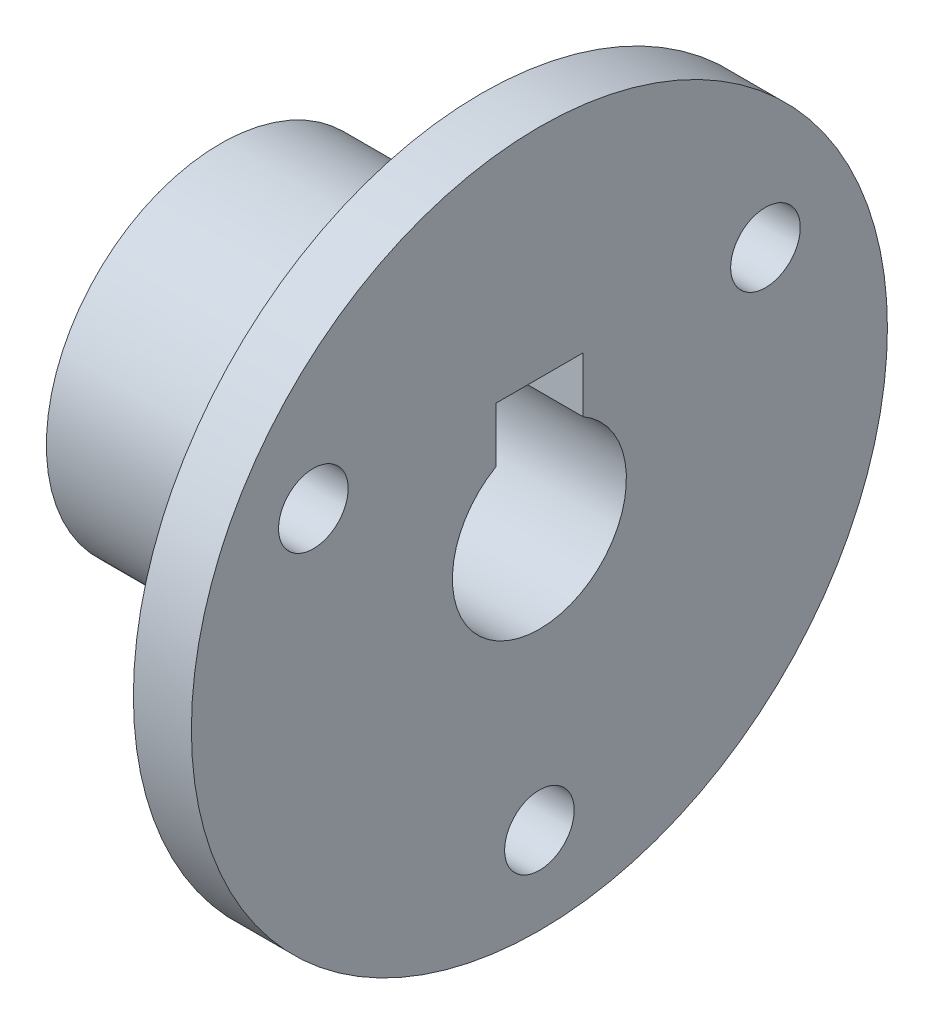
ISO-10303-21;
HEADER;
FILE_DESCRIPTION(('STEP AP214'),'2;1');
FILE_NAME('part.step','',(''),(''),'','','');
FILE_SCHEMA(('AUTOMOTIVE_DESIGN { 1 0 10303 214 1 1 1 1 }'));
ENDSEC;
DATA;
#1=APPLICATION_CONTEXT('core data for automotive mechanical design processes');
#2=APPLICATION_PROTOCOL_DEFINITION('international standard','automotive_design',2000,#1);
#3=PRODUCT_CONTEXT('',#1,'mechanical');
#4=PRODUCT('Part','Part','',(#3));
#5=PRODUCT_RELATED_PRODUCT_CATEGORY('part','',(#4));
#6=PRODUCT_DEFINITION_FORMATION('','',#4);
#7=PRODUCT_DEFINITION_CONTEXT('part definition',#1,'design');
#8=PRODUCT_DEFINITION('design','',#6,#7);
#9=PRODUCT_DEFINITION_SHAPE('','',#8);
#10=(LENGTH_UNIT() NAMED_UNIT(*) SI_UNIT(.MILLI.,.METRE.));
#11=(NAMED_UNIT(*) PLANE_ANGLE_UNIT() SI_UNIT($,.RADIAN.));
#12=(NAMED_UNIT(*) SI_UNIT($,.STERADIAN.) SOLID_ANGLE_UNIT());
#13=UNCERTAINTY_MEASURE_WITH_UNIT(LENGTH_MEASURE(1.E-05),#10,'distance_accuracy_value','');
#14=(GEOMETRIC_REPRESENTATION_CONTEXT(3) GLOBAL_UNCERTAINTY_ASSIGNED_CONTEXT((#13)) GLOBAL_UNIT_ASSIGNED_CONTEXT((#10,
#11,#12)) REPRESENTATION_CONTEXT('',''));
#15=CARTESIAN_POINT('',(0.,0.,0.));
#16=DIRECTION('',(0.,0.,1.));
#17=DIRECTION('',(1.,0.,0.));
#18=AXIS2_PLACEMENT_3D('',#15,#16,#17);
#19=CARTESIAN_POINT('',(10.,0.,0.));
#20=DIRECTION('',(-1.,0.,0.));
#21=DIRECTION('',(0.,0.,1.));
#22=AXIS2_PLACEMENT_3D('',#19,#20,#21);
#23=CYLINDRICAL_SURFACE('',#22,60.);
#24=CARTESIAN_POINT('',(10.,0.,0.));
#25=DIRECTION('',(-1.,0.,0.));
#26=DIRECTION('',(0.,0.,1.));
#27=AXIS2_PLACEMENT_3D('',#24,#25,#26);
#28=CIRCLE('',#27,60.);
#29=CARTESIAN_POINT('',(10.,0.,60.));
#30=VERTEX_POINT('',#29);
#31=EDGE_CURVE('E43',#30,#30,#28,.T.);
#32=ORIENTED_EDGE('',*,*,#31,.T.);
#33=EDGE_LOOP('',(#32));
#34=FACE_BOUND('',#33,.T.);
#35=CARTESIAN_POINT('',(0.,0.,0.));
#36=DIRECTION('',(-1.,0.,0.));
#37=DIRECTION('',(0.,0.,1.));
#38=AXIS2_PLACEMENT_3D('',#35,#36,#37);
#39=CIRCLE('',#38,60.);
#40=CARTESIAN_POINT('',(0.,0.,60.));
#41=VERTEX_POINT('',#40);
#42=EDGE_CURVE('E116',#41,#41,#39,.T.);
#43=ORIENTED_EDGE('',*,*,#42,.F.);
#44=EDGE_LOOP('',(#43));
#45=FACE_BOUND('',#44,.T.);
#46=ADVANCED_FACE('F40',(#34,#45),#23,.T.);
#47=CARTESIAN_POINT('',(10.,60.,0.));
#48=DIRECTION('',(1.,0.,0.));
#49=DIRECTION('',(0.,0.,-1.));
#50=AXIS2_PLACEMENT_3D('',#47,#48,#49);
#51=PLANE('',#50);
#52=CARTESIAN_POINT('',(10.,22.4999999999996,-38.9711431702999));
#53=DIRECTION('',(-1.,0.,0.));
#54=DIRECTION('',(0.,0.,1.));
#55=AXIS2_PLACEMENT_3D('',#52,#53,#54);
#56=CIRCLE('',#55,6.);
#57=CARTESIAN_POINT('',(10.,22.4999999999996,-32.9711431702999));
#58=VERTEX_POINT('',#57);
#59=EDGE_CURVE('E170',#58,#58,#56,.T.);
#60=ORIENTED_EDGE('',*,*,#59,.T.);
#61=EDGE_LOOP('',(#60));
#62=FACE_BOUND('',#61,.T.);
#63=CARTESIAN_POINT('',(10.,22.5000000000002,38.9711431702996));
#64=DIRECTION('',(-1.,0.,0.));
#65=DIRECTION('',(0.,0.,1.));
#66=AXIS2_PLACEMENT_3D('',#63,#64,#65);
#67=CIRCLE('',#66,6.);
#68=CARTESIAN_POINT('',(10.,22.5000000000002,44.9711431702996));
#69=VERTEX_POINT('',#68);
#70=EDGE_CURVE('E180',#69,#69,#67,.T.);
#71=ORIENTED_EDGE('',*,*,#70,.T.);
#72=EDGE_LOOP('',(#71));
#73=FACE_BOUND('',#72,.T.);
#74=CARTESIAN_POINT('',(10.,-45.,0.));
#75=DIRECTION('',(-1.,0.,0.));
#76=DIRECTION('',(0.,0.,1.));
#77=AXIS2_PLACEMENT_3D('',#74,#75,#76);
#78=CIRCLE('',#77,6.);
#79=CARTESIAN_POINT('',(10.,-45.,5.99999999999999));
#80=VERTEX_POINT('',#79);
#81=EDGE_CURVE('E88',#80,#80,#78,.T.);
#82=ORIENTED_EDGE('',*,*,#81,.T.);
#83=EDGE_LOOP('',(#82));
#84=FACE_BOUND('',#83,.T.);
#85=CARTESIAN_POINT('',(10.,0.,0.));
#86=DIRECTION('',(-1.,0.,0.));
#87=DIRECTION('',(0.,0.,1.));
#88=AXIS2_PLACEMENT_3D('',#85,#86,#87);
#89=CIRCLE('',#88,15.);
#90=CARTESIAN_POINT('',(10.,12.9903810567666,-7.5));
#91=VERTEX_POINT('',#90);
#92=CARTESIAN_POINT('',(10.,12.9903810567666,7.5));
#93=VERTEX_POINT('',#92);
#94=EDGE_CURVE('E55',#91,#93,#89,.T.);
#95=ORIENTED_EDGE('',*,*,#94,.T.);
#96=DIRECTION('',(0.,1.,0.));
#97=VECTOR('',#96,1.);
#98=CARTESIAN_POINT('',(10.,12.9903810567666,7.5));
#99=LINE('',#98,#97);
#100=CARTESIAN_POINT('',(10.,22.4956476755138,7.5));
#101=VERTEX_POINT('',#100);
#102=EDGE_CURVE('E96',#93,#101,#99,.T.);
#103=ORIENTED_EDGE('',*,*,#102,.T.);
#104=DIRECTION('',(0.,0.,-1.));
#105=VECTOR('',#104,1.);
#106=CARTESIAN_POINT('',(10.,22.4956476755138,7.5));
#107=LINE('',#106,#105);
#108=CARTESIAN_POINT('',(10.,22.4956476755138,-7.5));
#109=VERTEX_POINT('',#108);
#110=EDGE_CURVE('E101',#101,#109,#107,.T.);
#111=ORIENTED_EDGE('',*,*,#110,.T.);
#112=DIRECTION('',(0.,-1.,0.));
#113=VECTOR('',#112,1.);
#114=CARTESIAN_POINT('',(10.,22.4956476755138,-7.5));
#115=LINE('',#114,#113);
#116=EDGE_CURVE('E105',#109,#91,#115,.T.);
#117=ORIENTED_EDGE('',*,*,#116,.T.);
#118=EDGE_LOOP('',(#95,#103,#111,#117));
#119=FACE_BOUND('',#118,.T.);
#120=ORIENTED_EDGE('',*,*,#31,.F.);
#121=EDGE_LOOP('',(#120));
#122=FACE_BOUND('',#121,.T.);
#123=ADVANCED_FACE('F125',(#62,#73,#84,#119,#122),#51,.T.);
#124=CARTESIAN_POINT('',(0.,0.,0.));
#125=DIRECTION('',(-1.,0.,0.));
#126=DIRECTION('',(0.,0.,1.));
#127=AXIS2_PLACEMENT_3D('',#124,#125,#126);
#128=PLANE('',#127);
#129=CARTESIAN_POINT('',(0.,22.4999999999996,-38.9711431702999));
#130=DIRECTION('',(-1.,0.,0.));
#131=DIRECTION('',(0.,0.,1.));
#132=AXIS2_PLACEMENT_3D('',#129,#130,#131);
#133=CIRCLE('',#132,6.);
#134=CARTESIAN_POINT('',(0.,22.4999999999996,-32.9711431702999));
#135=VERTEX_POINT('',#134);
#136=EDGE_CURVE('E173',#135,#135,#133,.T.);
#137=ORIENTED_EDGE('',*,*,#136,.F.);
#138=EDGE_LOOP('',(#137));
#139=FACE_BOUND('',#138,.T.);
#140=CARTESIAN_POINT('',(0.,22.5000000000002,38.9711431702996));
#141=DIRECTION('',(-1.,0.,0.));
#142=DIRECTION('',(0.,0.,1.));
#143=AXIS2_PLACEMENT_3D('',#140,#141,#142);
#144=CIRCLE('',#143,6.);
#145=CARTESIAN_POINT('',(0.,22.5000000000002,44.9711431702996));
#146=VERTEX_POINT('',#145);
#147=EDGE_CURVE('E175',#146,#146,#144,.T.);
#148=ORIENTED_EDGE('',*,*,#147,.F.);
#149=EDGE_LOOP('',(#148));
#150=FACE_BOUND('',#149,.T.);
#151=CARTESIAN_POINT('',(0.,-45.,0.));
#152=DIRECTION('',(-1.,0.,0.));
#153=DIRECTION('',(0.,0.,1.));
#154=AXIS2_PLACEMENT_3D('',#151,#152,#153);
#155=CIRCLE('',#154,6.);
#156=CARTESIAN_POINT('',(0.,-45.,5.99999999999999));
#157=VERTEX_POINT('',#156);
#158=EDGE_CURVE('E183',#157,#157,#155,.T.);
#159=ORIENTED_EDGE('',*,*,#158,.F.);
#160=EDGE_LOOP('',(#159));
#161=FACE_BOUND('',#160,.T.);
#162=CARTESIAN_POINT('',(0.,0.,0.));
#163=DIRECTION('',(-1.,0.,0.));
#164=DIRECTION('',(0.,0.,1.));
#165=AXIS2_PLACEMENT_3D('',#162,#163,#164);
#166=CIRCLE('',#165,30.);
#167=CARTESIAN_POINT('',(0.,0.,-30.));
#168=VERTEX_POINT('',#167);
#169=EDGE_CURVE('E11',#168,#168,#166,.T.);
#170=ORIENTED_EDGE('',*,*,#169,.F.);
#171=EDGE_LOOP('',(#170));
#172=FACE_BOUND('',#171,.T.);
#173=ORIENTED_EDGE('',*,*,#42,.T.);
#174=EDGE_LOOP('',(#173));
#175=FACE_BOUND('',#174,.T.);
#176=ADVANCED_FACE('F127',(#139,#150,#161,#172,#175),#128,.T.);
#177=CARTESIAN_POINT('',(-45.,0.,0.));
#178=DIRECTION('',(1.,0.,0.));
#179=DIRECTION('',(0.,0.,-1.));
#180=AXIS2_PLACEMENT_3D('',#177,#178,#179);
#181=CYLINDRICAL_SURFACE('',#180,30.);
#182=CARTESIAN_POINT('',(-45.,0.,0.));
#183=DIRECTION('',(-1.,0.,0.));
#184=DIRECTION('',(0.,0.,1.));
#185=AXIS2_PLACEMENT_3D('',#182,#183,#184);
#186=CIRCLE('',#185,30.);
#187=CARTESIAN_POINT('',(-45.,0.,-30.));
#188=VERTEX_POINT('',#187);
#189=EDGE_CURVE('E110',#188,#188,#186,.T.);
#190=CARTESIAN_POINT('',(-45.,0.,-30.));
#191=CARTESIAN_POINT('',(-44.53125,0.,-30.));
#192=CARTESIAN_POINT('',(-44.0625,0.,-30.));
#193=CARTESIAN_POINT('',(-43.125,0.,-30.));
#194=CARTESIAN_POINT('',(-42.65625,0.,-30.));
#195=CARTESIAN_POINT('',(-41.71875,0.,-30.));
#196=CARTESIAN_POINT('',(-41.25,0.,-30.));
#197=CARTESIAN_POINT('',(-40.3125,0.,-30.));
#198=CARTESIAN_POINT('',(-39.84375,0.,-30.));
#199=CARTESIAN_POINT('',(-38.90625,0.,-30.));
#200=CARTESIAN_POINT('',(-38.4375,0.,-30.));
#201=CARTESIAN_POINT('',(-37.5,0.,-30.));
#202=CARTESIAN_POINT('',(-37.03125,0.,-30.));
#203=CARTESIAN_POINT('',(-36.09375,0.,-30.));
#204=CARTESIAN_POINT('',(-35.625,0.,-30.));
#205=CARTESIAN_POINT('',(-34.6875,0.,-30.));
#206=CARTESIAN_POINT('',(-34.21875,0.,-30.));
#207=CARTESIAN_POINT('',(-33.28125,0.,-30.));
#208=CARTESIAN_POINT('',(-32.8125,0.,-30.));
#209=CARTESIAN_POINT('',(-31.875,0.,-30.));
#210=CARTESIAN_POINT('',(-31.40625,0.,-30.));
#211=CARTESIAN_POINT('',(-30.46875,0.,-30.));
#212=CARTESIAN_POINT('',(-30.,0.,-30.));
#213=CARTESIAN_POINT('',(-29.0625,0.,-30.));
#214=CARTESIAN_POINT('',(-28.59375,0.,-30.));
#215=CARTESIAN_POINT('',(-27.65625,0.,-30.));
#216=CARTESIAN_POINT('',(-27.1875,0.,-30.));
#217=CARTESIAN_POINT('',(-26.25,0.,-30.));
#218=CARTESIAN_POINT('',(-25.78125,0.,-30.));
#219=CARTESIAN_POINT('',(-24.84375,0.,-30.));
#220=CARTESIAN_POINT('',(-24.375,0.,-30.));
#221=CARTESIAN_POINT('',(-23.4375,0.,-30.));
#222=CARTESIAN_POINT('',(-22.96875,0.,-30.));
#223=CARTESIAN_POINT('',(-22.03125,0.,-30.));
#224=CARTESIAN_POINT('',(-21.5625,0.,-30.));
#225=CARTESIAN_POINT('',(-20.625,0.,-30.));
#226=CARTESIAN_POINT('',(-20.15625,0.,-30.));
#227=CARTESIAN_POINT('',(-19.21875,0.,-30.));
#228=CARTESIAN_POINT('',(-18.75,0.,-30.));
#229=CARTESIAN_POINT('',(-17.8125,0.,-30.));
#230=CARTESIAN_POINT('',(-17.34375,0.,-30.));
#231=CARTESIAN_POINT('',(-16.40625,0.,-30.));
#232=CARTESIAN_POINT('',(-15.9375,0.,-30.));
#233=CARTESIAN_POINT('',(-15.,0.,-30.));
#234=CARTESIAN_POINT('',(-14.53125,0.,-30.));
#235=CARTESIAN_POINT('',(-13.59375,0.,-30.));
#236=CARTESIAN_POINT('',(-13.125,0.,-30.));
#237=CARTESIAN_POINT('',(-12.1875,0.,-30.));
#238=CARTESIAN_POINT('',(-11.71875,0.,-30.));
#239=CARTESIAN_POINT('',(-10.78125,0.,-30.));
#240=CARTESIAN_POINT('',(-10.3125,0.,-30.));
#241=CARTESIAN_POINT('',(-9.375,0.,-30.));
#242=CARTESIAN_POINT('',(-8.90625,0.,-30.));
#243=CARTESIAN_POINT('',(-7.96874999999999,0.,-30.));
#244=CARTESIAN_POINT('',(-7.5,0.,-30.));
#245=CARTESIAN_POINT('',(-6.5625,0.,-30.));
#246=CARTESIAN_POINT('',(-6.09375,0.,-30.));
#247=CARTESIAN_POINT('',(-5.15625,0.,-30.));
#248=CARTESIAN_POINT('',(-4.68749999999999,0.,-30.));
#249=CARTESIAN_POINT('',(-3.74999999999999,0.,-30.));
#250=CARTESIAN_POINT('',(-3.28124999999999,0.,-30.));
#251=CARTESIAN_POINT('',(-2.34374999999999,0.,-30.));
#252=CARTESIAN_POINT('',(-1.87499999999999,0.,-30.));
#253=CARTESIAN_POINT('',(-0.937499999999992,0.,-30.));
#254=CARTESIAN_POINT('',(-0.468749999999993,0.,-30.));
#255=CARTESIAN_POINT('',(0.,0.,-30.));
#256=B_SPLINE_CURVE_WITH_KNOTS('',3,(#190,#191,#192,#193,#194,#195,#196,#197,#198,#199,#200,
#201,#202,#203,#204,#205,#206,#207,#208,#209,#210,#211,#212,#213,#214,#215,#216,#217,#218,#219,
#220,#221,#222,#223,#224,#225,#226,#227,#228,#229,#230,#231,#232,#233,#234,#235,#236,#237,#238,
#239,#240,#241,#242,#243,#244,#245,#246,#247,#248,#249,#250,#251,#252,#253,#254,#255),
.UNSPECIFIED.,.F.,.F.,(4,2,2,2,2,2,2,2,2,2,2,2,2,2,2,2,2,2,2,2,2,2,2,2,2,2,2,2,2,2,2,2,4),(0.,
1.40625,2.8125,4.21875000000001,5.62500000000001,7.03125,8.4375,9.84375000000001,11.25,12.65625,
14.0625,15.46875,16.875,18.28125,19.6875,21.09375,22.5,23.90625,25.3125,26.71875,28.125,
29.53125,30.9375,32.34375,33.75,35.15625,36.5625,37.96875,39.375,40.78125,42.1875,43.59375,45.),.UNSPECIFIED.);
#257=EDGE_CURVE('BSEAM133',#188,#168,#256,.T.);
#258=ORIENTED_EDGE('',*,*,#189,.F.);
#259=ORIENTED_EDGE('',*,*,#169,.T.);
#260=ORIENTED_EDGE('',*,*,#257,.T.);
#261=ORIENTED_EDGE('',*,*,#257,.F.);
#262=EDGE_LOOP('',(#258,#260,#259,#261));
#263=FACE_BOUND('',#262,.T.);
#264=ADVANCED_FACE('F133',(#263),#181,.T.);
#265=CARTESIAN_POINT('',(-45.,0.,0.));
#266=DIRECTION('',(-1.,0.,0.));
#267=DIRECTION('',(0.,0.,1.));
#268=AXIS2_PLACEMENT_3D('',#265,#266,#267);
#269=PLANE('',#268);
#270=CARTESIAN_POINT('',(-45.,0.,0.));
#271=DIRECTION('',(-1.,0.,0.));
#272=DIRECTION('',(0.,0.,1.));
#273=AXIS2_PLACEMENT_3D('',#270,#271,#272);
#274=CIRCLE('',#273,15.);
#275=CARTESIAN_POINT('',(-45.,12.9903810567666,-7.5));
#276=VERTEX_POINT('',#275);
#277=CARTESIAN_POINT('',(-45.,12.9903810567666,7.5));
#278=VERTEX_POINT('',#277);
#279=EDGE_CURVE('E79',#276,#278,#274,.T.);
#280=ORIENTED_EDGE('',*,*,#279,.F.);
#281=DIRECTION('',(0.,-1.,0.));
#282=VECTOR('',#281,1.);
#283=CARTESIAN_POINT('',(-45.,22.4956476755138,-7.5));
#284=LINE('',#283,#282);
#285=CARTESIAN_POINT('',(-45.,22.4956476755138,-7.5));
#286=VERTEX_POINT('',#285);
#287=EDGE_CURVE('E102',#286,#276,#284,.T.);
#288=ORIENTED_EDGE('',*,*,#287,.F.);
#289=DIRECTION('',(0.,0.,-1.));
#290=VECTOR('',#289,1.);
#291=CARTESIAN_POINT('',(-45.,22.4956476755138,7.5));
#292=LINE('',#291,#290);
#293=CARTESIAN_POINT('',(-45.,22.4956476755138,7.5));
#294=VERTEX_POINT('',#293);
#295=EDGE_CURVE('E63',#294,#286,#292,.T.);
#296=ORIENTED_EDGE('',*,*,#295,.F.);
#297=DIRECTION('',(0.,1.,0.));
#298=VECTOR('',#297,1.);
#299=CARTESIAN_POINT('',(-45.,12.9903810567666,7.5));
#300=LINE('',#299,#298);
#301=EDGE_CURVE('E94',#278,#294,#300,.T.);
#302=ORIENTED_EDGE('',*,*,#301,.F.);
#303=EDGE_LOOP('',(#280,#288,#296,#302));
#304=FACE_BOUND('',#303,.T.);
#305=ORIENTED_EDGE('',*,*,#189,.T.);
#306=EDGE_LOOP('',(#305));
#307=FACE_BOUND('',#306,.T.);
#308=ADVANCED_FACE('F99',(#304,#307),#269,.T.);
#309=CARTESIAN_POINT('',(10.,22.4956476755138,7.5));
#310=DIRECTION('',(0.,1.,0.));
#311=DIRECTION('',(0.,0.,1.));
#312=AXIS2_PLACEMENT_3D('',#309,#310,#311);
#313=PLANE('',#312);
#314=ORIENTED_EDGE('',*,*,#295,.T.);
#315=DIRECTION('',(-1.,0.,0.));
#316=VECTOR('',#315,1.);
#317=CARTESIAN_POINT('',(10.,22.4956476755138,-7.5));
#318=LINE('',#317,#316);
#319=EDGE_CURVE('E113',#109,#286,#318,.T.);
#320=ORIENTED_EDGE('',*,*,#319,.F.);
#321=ORIENTED_EDGE('',*,*,#110,.F.);
#322=DIRECTION('',(-1.,0.,0.));
#323=VECTOR('',#322,1.);
#324=CARTESIAN_POINT('',(10.,22.4956476755138,7.5));
#325=LINE('',#324,#323);
#326=EDGE_CURVE('E97',#101,#294,#325,.T.);
#327=ORIENTED_EDGE('',*,*,#326,.T.);
#328=EDGE_LOOP('',(#314,#320,#321,#327));
#329=FACE_BOUND('',#328,.T.);
#330=ADVANCED_FACE('F144',(#329),#313,.F.);
#331=CARTESIAN_POINT('',(10.,12.9903810567666,7.5));
#332=DIRECTION('',(0.,0.,1.));
#333=DIRECTION('',(0.,-1.,0.));
#334=AXIS2_PLACEMENT_3D('',#331,#332,#333);
#335=PLANE('',#334);
#336=ORIENTED_EDGE('',*,*,#301,.T.);
#337=ORIENTED_EDGE('',*,*,#326,.F.);
#338=ORIENTED_EDGE('',*,*,#102,.F.);
#339=DIRECTION('',(-1.,0.,0.));
#340=VECTOR('',#339,1.);
#341=CARTESIAN_POINT('',(10.,12.9903810567666,7.5));
#342=LINE('',#341,#340);
#343=EDGE_CURVE('E82',#93,#278,#342,.T.);
#344=ORIENTED_EDGE('',*,*,#343,.T.);
#345=EDGE_LOOP('',(#336,#337,#338,#344));
#346=FACE_BOUND('',#345,.T.);
#347=ADVANCED_FACE('F93',(#346),#335,.F.);
#348=CARTESIAN_POINT('',(10.,22.4956476755138,-7.5));
#349=DIRECTION('',(0.,0.,-1.));
#350=DIRECTION('',(-1.,0.,0.));
#351=AXIS2_PLACEMENT_3D('',#348,#349,#350);
#352=PLANE('',#351);
#353=ORIENTED_EDGE('',*,*,#287,.T.);
#354=DIRECTION('',(-1.,0.,0.));
#355=VECTOR('',#354,1.);
#356=CARTESIAN_POINT('',(10.,12.9903810567666,-7.5));
#357=LINE('',#356,#355);
#358=EDGE_CURVE('E83',#91,#276,#357,.T.);
#359=ORIENTED_EDGE('',*,*,#358,.F.);
#360=ORIENTED_EDGE('',*,*,#116,.F.);
#361=ORIENTED_EDGE('',*,*,#319,.T.);
#362=EDGE_LOOP('',(#353,#359,#360,#361));
#363=FACE_BOUND('',#362,.T.);
#364=ADVANCED_FACE('F147',(#363),#352,.F.);
#365=CARTESIAN_POINT('',(10.,0.,0.));
#366=DIRECTION('',(-1.,0.,0.));
#367=DIRECTION('',(0.,0.,1.));
#368=AXIS2_PLACEMENT_3D('',#365,#366,#367);
#369=CYLINDRICAL_SURFACE('',#368,15.);
#370=ORIENTED_EDGE('',*,*,#94,.F.);
#371=ORIENTED_EDGE('',*,*,#358,.T.);
#372=ORIENTED_EDGE('',*,*,#279,.T.);
#373=ORIENTED_EDGE('',*,*,#343,.F.);
#374=EDGE_LOOP('',(#370,#371,#372,#373));
#375=FACE_BOUND('',#374,.T.);
#376=ADVANCED_FACE('F81',(#375),#369,.F.);
#377=CARTESIAN_POINT('',(0.,-45.,0.));
#378=DIRECTION('',(-1.,0.,0.));
#379=DIRECTION('',(0.,0.,1.));
#380=AXIS2_PLACEMENT_3D('',#377,#378,#379);
#381=CYLINDRICAL_SURFACE('',#380,6.);
#382=ORIENTED_EDGE('',*,*,#81,.F.);
#383=EDGE_LOOP('',(#382));
#384=FACE_BOUND('',#383,.T.);
#385=ORIENTED_EDGE('',*,*,#158,.T.);
#386=EDGE_LOOP('',(#385));
#387=FACE_BOUND('',#386,.T.);
#388=ADVANCED_FACE('F155',(#384,#387),#381,.F.);
#389=CARTESIAN_POINT('',(0.,22.5000000000002,38.9711431702996));
#390=DIRECTION('',(-1.,0.,0.));
#391=DIRECTION('',(0.,0.,1.));
#392=AXIS2_PLACEMENT_3D('',#389,#390,#391);
#393=CYLINDRICAL_SURFACE('',#392,6.);
#394=ORIENTED_EDGE('',*,*,#70,.F.);
#395=EDGE_LOOP('',(#394));
#396=FACE_BOUND('',#395,.T.);
#397=ORIENTED_EDGE('',*,*,#147,.T.);
#398=EDGE_LOOP('',(#397));
#399=FACE_BOUND('',#398,.T.);
#400=ADVANCED_FACE('F158',(#396,#399),#393,.F.);
#401=CARTESIAN_POINT('',(0.,22.4999999999996,-38.9711431702999));
#402=DIRECTION('',(-1.,0.,0.));
#403=DIRECTION('',(0.,0.,1.));
#404=AXIS2_PLACEMENT_3D('',#401,#402,#403);
#405=CYLINDRICAL_SURFACE('',#404,6.);
#406=ORIENTED_EDGE('',*,*,#59,.F.);
#407=EDGE_LOOP('',(#406));
#408=FACE_BOUND('',#407,.T.);
#409=ORIENTED_EDGE('',*,*,#136,.T.);
#410=EDGE_LOOP('',(#409));
#411=FACE_BOUND('',#410,.T.);
#412=ADVANCED_FACE('F162',(#408,#411),#405,.F.);
#413=CLOSED_SHELL('',(#46,#123,#176,#264,#308,#330,#347,#364,#376,#388,#400,#412));
#414=MANIFOLD_SOLID_BREP('B2',#413);
#415=ADVANCED_BREP_SHAPE_REPRESENTATION('',(#18,#414),#14);
#416=SHAPE_DEFINITION_REPRESENTATION(#9,#415);
ENDSEC;
END-ISO-10303-21;
